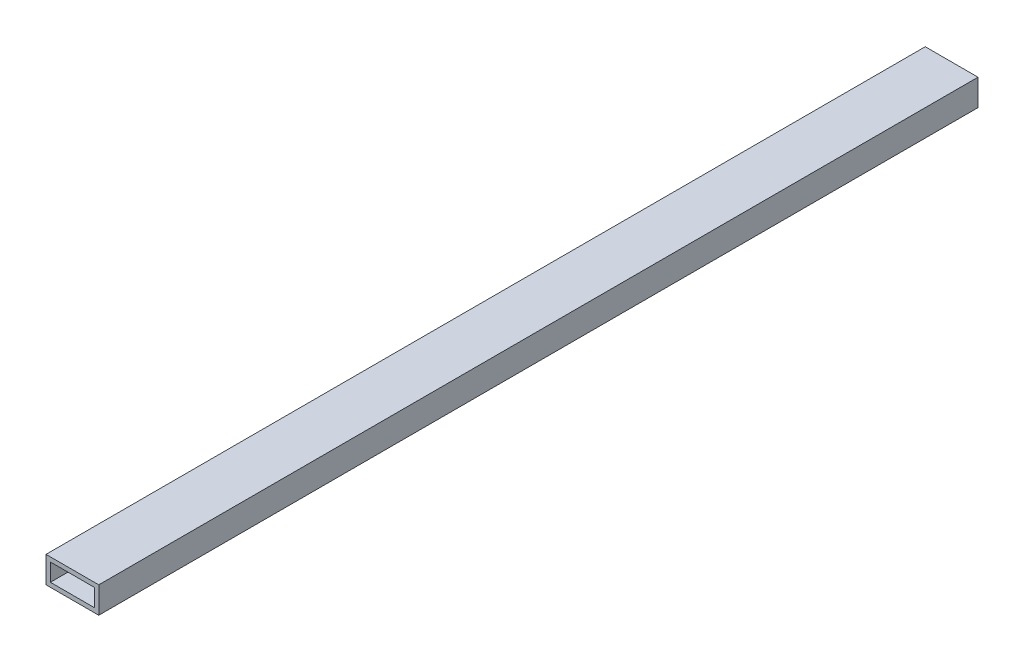
ISO-10303-21;
HEADER;
FILE_DESCRIPTION(('STEP AP214'),'2;1');
FILE_NAME('part.step','',(''),(''),'','','');
FILE_SCHEMA(('AUTOMOTIVE_DESIGN { 1 0 10303 214 1 1 1 1 }'));
ENDSEC;
DATA;
#1=APPLICATION_CONTEXT('core data for automotive mechanical design processes');
#2=APPLICATION_PROTOCOL_DEFINITION('international standard','automotive_design',2000,#1);
#3=PRODUCT_CONTEXT('',#1,'mechanical');
#4=PRODUCT('Part','Part','',(#3));
#5=PRODUCT_RELATED_PRODUCT_CATEGORY('part','',(#4));
#6=PRODUCT_DEFINITION_FORMATION('','',#4);
#7=PRODUCT_DEFINITION_CONTEXT('part definition',#1,'design');
#8=PRODUCT_DEFINITION('design','',#6,#7);
#9=PRODUCT_DEFINITION_SHAPE('','',#8);
#10=(LENGTH_UNIT() NAMED_UNIT(*) SI_UNIT(.MILLI.,.METRE.));
#11=(NAMED_UNIT(*) PLANE_ANGLE_UNIT() SI_UNIT($,.RADIAN.));
#12=(NAMED_UNIT(*) SI_UNIT($,.STERADIAN.) SOLID_ANGLE_UNIT());
#13=UNCERTAINTY_MEASURE_WITH_UNIT(LENGTH_MEASURE(1.E-05),#10,'distance_accuracy_value','');
#14=(GEOMETRIC_REPRESENTATION_CONTEXT(3) GLOBAL_UNCERTAINTY_ASSIGNED_CONTEXT((#13)) GLOBAL_UNIT_ASSIGNED_CONTEXT((#10,
#11,#12)) REPRESENTATION_CONTEXT('',''));
#15=CARTESIAN_POINT('',(0.,0.,0.));
#16=DIRECTION('',(0.,0.,1.));
#17=DIRECTION('',(1.,0.,0.));
#18=AXIS2_PLACEMENT_3D('',#15,#16,#17);
#19=CARTESIAN_POINT('',(0.,0.,317.5));
#20=DIRECTION('',(0.,0.,1.));
#21=DIRECTION('',(1.,0.,0.));
#22=AXIS2_PLACEMENT_3D('',#19,#20,#21);
#23=PLANE('',#22);
#24=DIRECTION('',(0.,-1.,0.));
#25=VECTOR('',#24,1.);
#26=CARTESIAN_POINT('',(-19.05,9.525,317.5));
#27=LINE('',#26,#25);
#28=CARTESIAN_POINT('',(-19.05,9.525,317.5));
#29=VERTEX_POINT('',#28);
#30=CARTESIAN_POINT('',(-19.05,-9.525,317.5));
#31=VERTEX_POINT('',#30);
#32=EDGE_CURVE('E121',#29,#31,#27,.T.);
#33=ORIENTED_EDGE('',*,*,#32,.T.);
#34=DIRECTION('',(1.,0.,0.));
#35=VECTOR('',#34,1.);
#36=CARTESIAN_POINT('',(-19.05,-9.525,317.5));
#37=LINE('',#36,#35);
#38=CARTESIAN_POINT('',(19.05,-9.525,317.5));
#39=VERTEX_POINT('',#38);
#40=EDGE_CURVE('E180',#31,#39,#37,.T.);
#41=ORIENTED_EDGE('',*,*,#40,.T.);
#42=DIRECTION('',(0.,1.,0.));
#43=VECTOR('',#42,1.);
#44=CARTESIAN_POINT('',(19.05,-9.525,317.5));
#45=LINE('',#44,#43);
#46=CARTESIAN_POINT('',(19.05,9.525,317.5));
#47=VERTEX_POINT('',#46);
#48=EDGE_CURVE('E183',#39,#47,#45,.T.);
#49=ORIENTED_EDGE('',*,*,#48,.T.);
#50=DIRECTION('',(-1.,0.,0.));
#51=VECTOR('',#50,1.);
#52=CARTESIAN_POINT('',(19.05,9.525,317.5));
#53=LINE('',#52,#51);
#54=EDGE_CURVE('E67',#47,#29,#53,.T.);
#55=ORIENTED_EDGE('',*,*,#54,.T.);
#56=EDGE_LOOP('',(#33,#41,#49,#55));
#57=FACE_BOUND('',#56,.T.);
#58=DIRECTION('',(1.,0.,0.));
#59=VECTOR('',#58,1.);
#60=CARTESIAN_POINT('',(-15.875,-6.35,317.5));
#61=LINE('',#60,#59);
#62=CARTESIAN_POINT('',(-15.875,-6.35,317.5));
#63=VERTEX_POINT('',#62);
#64=CARTESIAN_POINT('',(15.875,-6.35,317.5));
#65=VERTEX_POINT('',#64);
#66=EDGE_CURVE('E162',#63,#65,#61,.T.);
#67=ORIENTED_EDGE('',*,*,#66,.F.);
#68=DIRECTION('',(0.,-1.,0.));
#69=VECTOR('',#68,1.);
#70=CARTESIAN_POINT('',(-15.875,6.35,317.5));
#71=LINE('',#70,#69);
#72=CARTESIAN_POINT('',(-15.875,6.35,317.5));
#73=VERTEX_POINT('',#72);
#74=EDGE_CURVE('E117',#73,#63,#71,.T.);
#75=ORIENTED_EDGE('',*,*,#74,.F.);
#76=DIRECTION('',(-1.,0.,0.));
#77=VECTOR('',#76,1.);
#78=CARTESIAN_POINT('',(15.875,6.35,317.5));
#79=LINE('',#78,#77);
#80=CARTESIAN_POINT('',(15.875,6.35,317.5));
#81=VERTEX_POINT('',#80);
#82=EDGE_CURVE('E168',#81,#73,#79,.T.);
#83=ORIENTED_EDGE('',*,*,#82,.F.);
#84=DIRECTION('',(0.,1.,0.));
#85=VECTOR('',#84,1.);
#86=CARTESIAN_POINT('',(15.875,-6.35,317.5));
#87=LINE('',#86,#85);
#88=EDGE_CURVE('E165',#65,#81,#87,.T.);
#89=ORIENTED_EDGE('',*,*,#88,.F.);
#90=EDGE_LOOP('',(#67,#75,#83,#89));
#91=FACE_BOUND('',#90,.T.);
#92=ADVANCED_FACE('F43',(#57,#91),#23,.T.);
#93=CARTESIAN_POINT('',(-19.05,9.525,317.5));
#94=DIRECTION('',(1.,0.,0.));
#95=DIRECTION('',(0.,0.,-1.));
#96=AXIS2_PLACEMENT_3D('',#93,#94,#95);
#97=PLANE('',#96);
#98=DIRECTION('',(0.,0.,-1.));
#99=VECTOR('',#98,1.);
#100=CARTESIAN_POINT('',(-19.05,9.525,317.5));
#101=LINE('',#100,#99);
#102=CARTESIAN_POINT('',(-19.05,9.525,-317.5));
#103=VERTEX_POINT('',#102);
#104=EDGE_CURVE('E188',#29,#103,#101,.T.);
#105=ORIENTED_EDGE('',*,*,#104,.T.);
#106=DIRECTION('',(0.,-1.,0.));
#107=VECTOR('',#106,1.);
#108=CARTESIAN_POINT('',(-19.05,9.525,-317.5));
#109=LINE('',#108,#107);
#110=CARTESIAN_POINT('',(-19.05,-9.525,-317.5));
#111=VERTEX_POINT('',#110);
#112=EDGE_CURVE('E144',#103,#111,#109,.T.);
#113=ORIENTED_EDGE('',*,*,#112,.T.);
#114=DIRECTION('',(0.,0.,-1.));
#115=VECTOR('',#114,1.);
#116=CARTESIAN_POINT('',(-19.05,-9.525,317.5));
#117=LINE('',#116,#115);
#118=EDGE_CURVE('E11',#31,#111,#117,.T.);
#119=ORIENTED_EDGE('',*,*,#118,.F.);
#120=ORIENTED_EDGE('',*,*,#32,.F.);
#121=EDGE_LOOP('',(#105,#113,#119,#120));
#122=FACE_BOUND('',#121,.T.);
#123=ADVANCED_FACE('F45',(#122),#97,.F.);
#124=CARTESIAN_POINT('',(-19.05,-9.525,317.5));
#125=DIRECTION('',(0.,1.,0.));
#126=DIRECTION('',(-1.,0.,0.));
#127=AXIS2_PLACEMENT_3D('',#124,#125,#126);
#128=PLANE('',#127);
#129=ORIENTED_EDGE('',*,*,#118,.T.);
#130=DIRECTION('',(1.,0.,0.));
#131=VECTOR('',#130,1.);
#132=CARTESIAN_POINT('',(-19.05,-9.525,-317.5));
#133=LINE('',#132,#131);
#134=CARTESIAN_POINT('',(19.05,-9.525,-317.5));
#135=VERTEX_POINT('',#134);
#136=EDGE_CURVE('E148',#111,#135,#133,.T.);
#137=ORIENTED_EDGE('',*,*,#136,.T.);
#138=DIRECTION('',(0.,0.,-1.));
#139=VECTOR('',#138,1.);
#140=CARTESIAN_POINT('',(19.05,-9.525,317.5));
#141=LINE('',#140,#139);
#142=EDGE_CURVE('E52',#39,#135,#141,.T.);
#143=ORIENTED_EDGE('',*,*,#142,.F.);
#144=ORIENTED_EDGE('',*,*,#40,.F.);
#145=EDGE_LOOP('',(#129,#137,#143,#144));
#146=FACE_BOUND('',#145,.T.);
#147=ADVANCED_FACE('F204',(#146),#128,.F.);
#148=CARTESIAN_POINT('',(19.05,-9.525,317.5));
#149=DIRECTION('',(-1.,0.,0.));
#150=DIRECTION('',(0.,-1.,0.));
#151=AXIS2_PLACEMENT_3D('',#148,#149,#150);
#152=PLANE('',#151);
#153=ORIENTED_EDGE('',*,*,#142,.T.);
#154=DIRECTION('',(0.,1.,0.));
#155=VECTOR('',#154,1.);
#156=CARTESIAN_POINT('',(19.05,-9.525,-317.5));
#157=LINE('',#156,#155);
#158=CARTESIAN_POINT('',(19.05,9.525,-317.5));
#159=VERTEX_POINT('',#158);
#160=EDGE_CURVE('E152',#135,#159,#157,.T.);
#161=ORIENTED_EDGE('',*,*,#160,.T.);
#162=DIRECTION('',(0.,0.,-1.));
#163=VECTOR('',#162,1.);
#164=CARTESIAN_POINT('',(19.05,9.525,317.5));
#165=LINE('',#164,#163);
#166=EDGE_CURVE('E191',#47,#159,#165,.T.);
#167=ORIENTED_EDGE('',*,*,#166,.F.);
#168=ORIENTED_EDGE('',*,*,#48,.F.);
#169=EDGE_LOOP('',(#153,#161,#167,#168));
#170=FACE_BOUND('',#169,.T.);
#171=ADVANCED_FACE('F198',(#170),#152,.F.);
#172=CARTESIAN_POINT('',(19.05,9.525,317.5));
#173=DIRECTION('',(0.,-1.,0.));
#174=DIRECTION('',(1.,0.,0.));
#175=AXIS2_PLACEMENT_3D('',#172,#173,#174);
#176=PLANE('',#175);
#177=ORIENTED_EDGE('',*,*,#166,.T.);
#178=DIRECTION('',(-1.,0.,0.));
#179=VECTOR('',#178,1.);
#180=CARTESIAN_POINT('',(19.05,9.525,-317.5));
#181=LINE('',#180,#179);
#182=EDGE_CURVE('E156',#159,#103,#181,.T.);
#183=ORIENTED_EDGE('',*,*,#182,.T.);
#184=ORIENTED_EDGE('',*,*,#104,.F.);
#185=ORIENTED_EDGE('',*,*,#54,.F.);
#186=EDGE_LOOP('',(#177,#183,#184,#185));
#187=FACE_BOUND('',#186,.T.);
#188=ADVANCED_FACE('F209',(#187),#176,.F.);
#189=CARTESIAN_POINT('',(-15.875,6.35,317.5));
#190=DIRECTION('',(1.,0.,0.));
#191=DIRECTION('',(0.,1.,0.));
#192=AXIS2_PLACEMENT_3D('',#189,#190,#191);
#193=PLANE('',#192);
#194=DIRECTION('',(0.,0.,-1.));
#195=VECTOR('',#194,1.);
#196=CARTESIAN_POINT('',(-15.875,-6.35,317.5));
#197=LINE('',#196,#195);
#198=CARTESIAN_POINT('',(-15.875,-6.35,-317.5));
#199=VERTEX_POINT('',#198);
#200=EDGE_CURVE('E109',#63,#199,#197,.T.);
#201=ORIENTED_EDGE('',*,*,#200,.T.);
#202=DIRECTION('',(0.,-1.,0.));
#203=VECTOR('',#202,1.);
#204=CARTESIAN_POINT('',(-15.875,6.35,-317.5));
#205=LINE('',#204,#203);
#206=CARTESIAN_POINT('',(-15.875,6.35,-317.5));
#207=VERTEX_POINT('',#206);
#208=EDGE_CURVE('E114',#207,#199,#205,.T.);
#209=ORIENTED_EDGE('',*,*,#208,.F.);
#210=DIRECTION('',(0.,0.,-1.));
#211=VECTOR('',#210,1.);
#212=CARTESIAN_POINT('',(-15.875,6.35,317.5));
#213=LINE('',#212,#211);
#214=EDGE_CURVE('E171',#73,#207,#213,.T.);
#215=ORIENTED_EDGE('',*,*,#214,.F.);
#216=ORIENTED_EDGE('',*,*,#74,.T.);
#217=EDGE_LOOP('',(#201,#209,#215,#216));
#218=FACE_BOUND('',#217,.T.);
#219=ADVANCED_FACE('F111',(#218),#193,.T.);
#220=CARTESIAN_POINT('',(-15.875,-6.35,317.5));
#221=DIRECTION('',(0.,1.,0.));
#222=DIRECTION('',(-1.,0.,0.));
#223=AXIS2_PLACEMENT_3D('',#220,#221,#222);
#224=PLANE('',#223);
#225=DIRECTION('',(0.,0.,-1.));
#226=VECTOR('',#225,1.);
#227=CARTESIAN_POINT('',(15.875,-6.35,317.5));
#228=LINE('',#227,#226);
#229=CARTESIAN_POINT('',(15.875,-6.35,-317.5));
#230=VERTEX_POINT('',#229);
#231=EDGE_CURVE('E122',#65,#230,#228,.T.);
#232=ORIENTED_EDGE('',*,*,#231,.T.);
#233=DIRECTION('',(1.,0.,0.));
#234=VECTOR('',#233,1.);
#235=CARTESIAN_POINT('',(-15.875,-6.35,-317.5));
#236=LINE('',#235,#234);
#237=EDGE_CURVE('E125',#199,#230,#236,.T.);
#238=ORIENTED_EDGE('',*,*,#237,.F.);
#239=ORIENTED_EDGE('',*,*,#200,.F.);
#240=ORIENTED_EDGE('',*,*,#66,.T.);
#241=EDGE_LOOP('',(#232,#238,#239,#240));
#242=FACE_BOUND('',#241,.T.);
#243=ADVANCED_FACE('F126',(#242),#224,.T.);
#244=CARTESIAN_POINT('',(15.875,-6.35,317.5));
#245=DIRECTION('',(-1.,0.,0.));
#246=DIRECTION('',(0.,-1.,0.));
#247=AXIS2_PLACEMENT_3D('',#244,#245,#246);
#248=PLANE('',#247);
#249=DIRECTION('',(0.,0.,-1.));
#250=VECTOR('',#249,1.);
#251=CARTESIAN_POINT('',(15.875,6.35,317.5));
#252=LINE('',#251,#250);
#253=CARTESIAN_POINT('',(15.875,6.35,-317.5));
#254=VERTEX_POINT('',#253);
#255=EDGE_CURVE('E59',#81,#254,#252,.T.);
#256=ORIENTED_EDGE('',*,*,#255,.T.);
#257=DIRECTION('',(0.,1.,0.));
#258=VECTOR('',#257,1.);
#259=CARTESIAN_POINT('',(15.875,-6.35,-317.5));
#260=LINE('',#259,#258);
#261=EDGE_CURVE('E132',#230,#254,#260,.T.);
#262=ORIENTED_EDGE('',*,*,#261,.F.);
#263=ORIENTED_EDGE('',*,*,#231,.F.);
#264=ORIENTED_EDGE('',*,*,#88,.T.);
#265=EDGE_LOOP('',(#256,#262,#263,#264));
#266=FACE_BOUND('',#265,.T.);
#267=ADVANCED_FACE('F227',(#266),#248,.T.);
#268=CARTESIAN_POINT('',(15.875,6.35,317.5));
#269=DIRECTION('',(0.,-1.,0.));
#270=DIRECTION('',(0.,0.,-1.));
#271=AXIS2_PLACEMENT_3D('',#268,#269,#270);
#272=PLANE('',#271);
#273=ORIENTED_EDGE('',*,*,#214,.T.);
#274=DIRECTION('',(-1.,0.,0.));
#275=VECTOR('',#274,1.);
#276=CARTESIAN_POINT('',(15.875,6.35,-317.5));
#277=LINE('',#276,#275);
#278=EDGE_CURVE('E136',#254,#207,#277,.T.);
#279=ORIENTED_EDGE('',*,*,#278,.F.);
#280=ORIENTED_EDGE('',*,*,#255,.F.);
#281=ORIENTED_EDGE('',*,*,#82,.T.);
#282=EDGE_LOOP('',(#273,#279,#280,#281));
#283=FACE_BOUND('',#282,.T.);
#284=ADVANCED_FACE('F230',(#283),#272,.T.);
#285=CARTESIAN_POINT('',(0.,0.,-317.5));
#286=DIRECTION('',(0.,0.,1.));
#287=DIRECTION('',(1.,0.,0.));
#288=AXIS2_PLACEMENT_3D('',#285,#286,#287);
#289=PLANE('',#288);
#290=ORIENTED_EDGE('',*,*,#278,.T.);
#291=ORIENTED_EDGE('',*,*,#208,.T.);
#292=ORIENTED_EDGE('',*,*,#237,.T.);
#293=ORIENTED_EDGE('',*,*,#261,.T.);
#294=EDGE_LOOP('',(#290,#291,#292,#293));
#295=FACE_BOUND('',#294,.T.);
#296=ORIENTED_EDGE('',*,*,#112,.F.);
#297=ORIENTED_EDGE('',*,*,#182,.F.);
#298=ORIENTED_EDGE('',*,*,#160,.F.);
#299=ORIENTED_EDGE('',*,*,#136,.F.);
#300=EDGE_LOOP('',(#296,#297,#298,#299));
#301=FACE_BOUND('',#300,.T.);
#302=ADVANCED_FACE('F134',(#295,#301),#289,.F.);
#303=CLOSED_SHELL('',(#92,#123,#147,#171,#188,#219,#243,#267,#284,#302));
#304=MANIFOLD_SOLID_BREP('B2',#303);
#305=ADVANCED_BREP_SHAPE_REPRESENTATION('',(#18,#304),#14);
#306=SHAPE_DEFINITION_REPRESENTATION(#9,#305);
ENDSEC;
END-ISO-10303-21;
